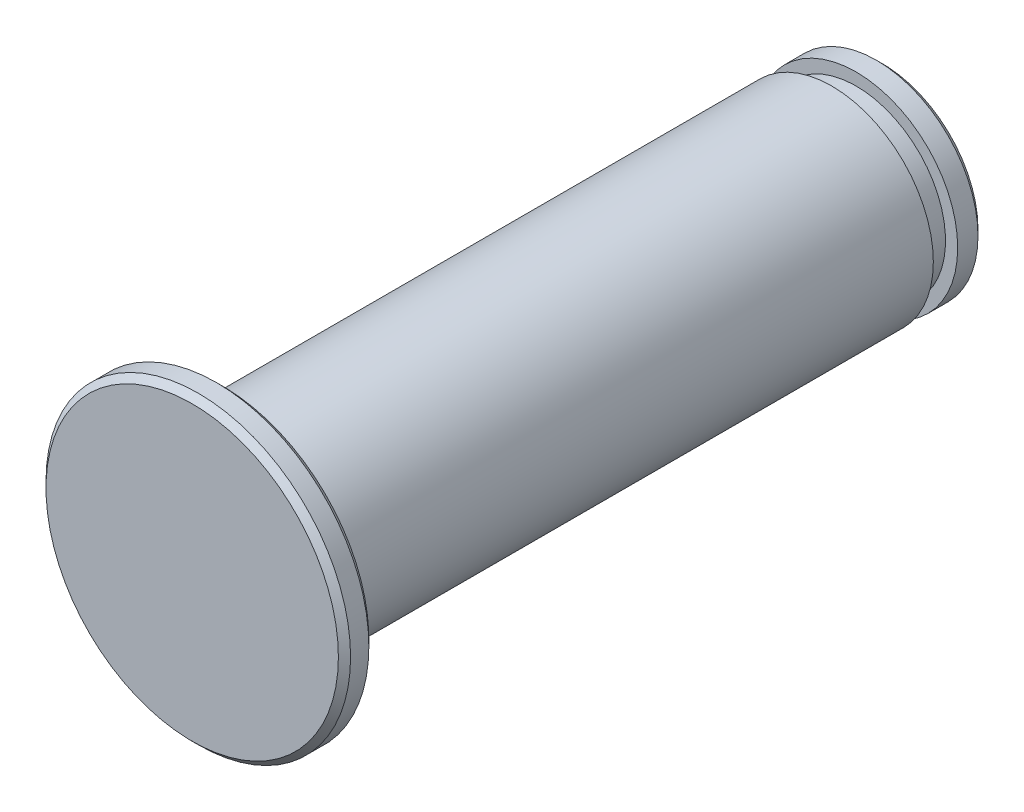
ISO-10303-21;
HEADER;
FILE_DESCRIPTION(('STEP AP214'),'2;1');
FILE_NAME('part.step','',(''),(''),'','','');
FILE_SCHEMA(('AUTOMOTIVE_DESIGN { 1 0 10303 214 1 1 1 1 }'));
ENDSEC;
DATA;
#1=APPLICATION_CONTEXT('core data for automotive mechanical design processes');
#2=APPLICATION_PROTOCOL_DEFINITION('international standard','automotive_design',2000,#1);
#3=PRODUCT_CONTEXT('',#1,'mechanical');
#4=PRODUCT('Part','Part','',(#3));
#5=PRODUCT_RELATED_PRODUCT_CATEGORY('part','',(#4));
#6=PRODUCT_DEFINITION_FORMATION('','',#4);
#7=PRODUCT_DEFINITION_CONTEXT('part definition',#1,'design');
#8=PRODUCT_DEFINITION('design','',#6,#7);
#9=PRODUCT_DEFINITION_SHAPE('','',#8);
#10=(LENGTH_UNIT() NAMED_UNIT(*) SI_UNIT(.MILLI.,.METRE.));
#11=(NAMED_UNIT(*) PLANE_ANGLE_UNIT() SI_UNIT($,.RADIAN.));
#12=(NAMED_UNIT(*) SI_UNIT($,.STERADIAN.) SOLID_ANGLE_UNIT());
#13=UNCERTAINTY_MEASURE_WITH_UNIT(LENGTH_MEASURE(1.E-05),#10,'distance_accuracy_value','');
#14=(GEOMETRIC_REPRESENTATION_CONTEXT(3) GLOBAL_UNCERTAINTY_ASSIGNED_CONTEXT((#13)) GLOBAL_UNIT_ASSIGNED_CONTEXT((#10,
#11,#12)) REPRESENTATION_CONTEXT('',''));
#15=CARTESIAN_POINT('',(0.,0.,0.));
#16=DIRECTION('',(0.,0.,1.));
#17=DIRECTION('',(1.,0.,0.));
#18=AXIS2_PLACEMENT_3D('',#15,#16,#17);
#19=CARTESIAN_POINT('',(0.,0.,17.6184151785714));
#20=DIRECTION('',(0.,0.,1.));
#21=DIRECTION('',(1.,0.,0.));
#22=AXIS2_PLACEMENT_3D('',#19,#20,#21);
#23=PLANE('',#22);
#24=CARTESIAN_POINT('',(0.,0.,17.6184151785714));
#25=DIRECTION('',(0.,0.,1.));
#26=DIRECTION('',(1.,0.,0.));
#27=AXIS2_PLACEMENT_3D('',#24,#25,#26);
#28=CIRCLE('',#27,7.19999999999999);
#29=CARTESIAN_POINT('',(7.19999999999999,0.,17.6184151785714));
#30=VERTEX_POINT('',#29);
#31=EDGE_CURVE('E36',#30,#30,#28,.T.);
#32=ORIENTED_EDGE('',*,*,#31,.T.);
#33=EDGE_LOOP('',(#32));
#34=FACE_BOUND('',#33,.T.);
#35=ADVANCED_FACE('F29',(#34),#23,.T.);
#36=CARTESIAN_POINT('',(0.,0.,-34.4572544642857));
#37=DIRECTION('',(0.,0.,-1.));
#38=DIRECTION('',(-1.,0.,0.));
#39=AXIS2_PLACEMENT_3D('',#36,#37,#38);
#40=CYLINDRICAL_SURFACE('',#39,7.49999999999999);
#41=CARTESIAN_POINT('',(0.,0.,17.3184151785714));
#42=DIRECTION('',(0.,0.,1.));
#43=DIRECTION('',(1.,0.,0.));
#44=AXIS2_PLACEMENT_3D('',#41,#42,#43);
#45=CIRCLE('',#44,7.49999999999999);
#46=CARTESIAN_POINT('',(7.49999999999999,0.,17.3184151785714));
#47=VERTEX_POINT('',#46);
#48=EDGE_CURVE('E40',#47,#47,#45,.F.);
#49=ORIENTED_EDGE('',*,*,#48,.T.);
#50=EDGE_LOOP('',(#49));
#51=FACE_BOUND('',#50,.T.);
#52=CARTESIAN_POINT('',(0.,0.,16.4184151785714));
#53=DIRECTION('',(0.,0.,-1.));
#54=DIRECTION('',(-1.,0.,0.));
#55=AXIS2_PLACEMENT_3D('',#52,#53,#54);
#56=CIRCLE('',#55,7.49999999999999);
#57=CARTESIAN_POINT('',(-7.49999999999999,0.,16.4184151785714));
#58=VERTEX_POINT('',#57);
#59=EDGE_CURVE('E44',#58,#58,#56,.F.);
#60=ORIENTED_EDGE('',*,*,#59,.T.);
#61=EDGE_LOOP('',(#60));
#62=FACE_BOUND('',#61,.T.);
#63=ADVANCED_FACE('F89',(#51,#62),#40,.T.);
#64=CARTESIAN_POINT('',(-7.49999999999999,0.,16.1184151785714));
#65=DIRECTION('',(0.,0.,-1.));
#66=DIRECTION('',(-1.,0.,0.));
#67=AXIS2_PLACEMENT_3D('',#64,#65,#66);
#68=PLANE('',#67);
#69=CARTESIAN_POINT('',(0.,0.,16.1184151785714));
#70=DIRECTION('',(0.,0.,-1.));
#71=DIRECTION('',(-1.,0.,0.));
#72=AXIS2_PLACEMENT_3D('',#69,#70,#71);
#73=CIRCLE('',#72,7.19999999999999);
#74=CARTESIAN_POINT('',(-7.19999999999999,0.,16.1184151785714));
#75=VERTEX_POINT('',#74);
#76=EDGE_CURVE('E10',#75,#75,#73,.T.);
#77=ORIENTED_EDGE('',*,*,#76,.T.);
#78=EDGE_LOOP('',(#77));
#79=FACE_BOUND('',#78,.T.);
#80=CARTESIAN_POINT('',(0.,0.,16.1184151785714));
#81=DIRECTION('',(0.,0.,-1.));
#82=DIRECTION('',(-1.,0.,0.));
#83=AXIS2_PLACEMENT_3D('',#80,#81,#82);
#84=CIRCLE('',#83,4.99999999999999);
#85=CARTESIAN_POINT('',(-4.99999999999999,0.,16.1184151785714));
#86=VERTEX_POINT('',#85);
#87=EDGE_CURVE('E55',#86,#86,#84,.T.);
#88=ORIENTED_EDGE('',*,*,#87,.F.);
#89=EDGE_LOOP('',(#88));
#90=FACE_BOUND('',#89,.T.);
#91=ADVANCED_FACE('F94',(#79,#90),#68,.T.);
#92=CARTESIAN_POINT('',(0.,0.,-34.4572544642857));
#93=DIRECTION('',(0.,0.,-1.));
#94=DIRECTION('',(-1.,0.,0.));
#95=AXIS2_PLACEMENT_3D('',#92,#93,#94);
#96=CYLINDRICAL_SURFACE('',#95,4.99999999999999);
#97=ORIENTED_EDGE('',*,*,#87,.T.);
#98=EDGE_LOOP('',(#97));
#99=FACE_BOUND('',#98,.T.);
#100=CARTESIAN_POINT('',(0.,0.,-13.8815848214286));
#101=DIRECTION('',(0.,0.,-1.));
#102=DIRECTION('',(-1.,0.,0.));
#103=AXIS2_PLACEMENT_3D('',#100,#101,#102);
#104=CIRCLE('',#103,4.99999999999999);
#105=CARTESIAN_POINT('',(-4.99999999999999,0.,-13.8815848214286));
#106=VERTEX_POINT('',#105);
#107=EDGE_CURVE('E58',#106,#106,#104,.T.);
#108=ORIENTED_EDGE('',*,*,#107,.F.);
#109=EDGE_LOOP('',(#108));
#110=FACE_BOUND('',#109,.T.);
#111=ADVANCED_FACE('F151',(#99,#110),#96,.T.);
#112=CARTESIAN_POINT('',(-4.99999999999999,0.,-13.8815848214286));
#113=DIRECTION('',(0.,0.,-1.));
#114=DIRECTION('',(-1.,0.,0.));
#115=AXIS2_PLACEMENT_3D('',#112,#113,#114);
#116=PLANE('',#115);
#117=ORIENTED_EDGE('',*,*,#107,.T.);
#118=EDGE_LOOP('',(#117));
#119=FACE_BOUND('',#118,.T.);
#120=CARTESIAN_POINT('',(0.,0.,-13.8815848214286));
#121=DIRECTION('',(0.,0.,-1.));
#122=DIRECTION('',(-1.,0.,0.));
#123=AXIS2_PLACEMENT_3D('',#120,#121,#122);
#124=CIRCLE('',#123,4.39999999999999);
#125=CARTESIAN_POINT('',(-4.39999999999999,0.,-13.8815848214286));
#126=VERTEX_POINT('',#125);
#127=EDGE_CURVE('E61',#126,#126,#124,.T.);
#128=ORIENTED_EDGE('',*,*,#127,.F.);
#129=EDGE_LOOP('',(#128));
#130=FACE_BOUND('',#129,.T.);
#131=ADVANCED_FACE('F85',(#119,#130),#116,.T.);
#132=CARTESIAN_POINT('',(0.,0.,-34.4572544642857));
#133=DIRECTION('',(0.,0.,-1.));
#134=DIRECTION('',(-1.,0.,0.));
#135=AXIS2_PLACEMENT_3D('',#132,#133,#134);
#136=CYLINDRICAL_SURFACE('',#135,4.39999999999999);
#137=ORIENTED_EDGE('',*,*,#127,.T.);
#138=EDGE_LOOP('',(#137));
#139=FACE_BOUND('',#138,.T.);
#140=CARTESIAN_POINT('',(0.,0.,-15.0815848214286));
#141=DIRECTION('',(0.,0.,-1.));
#142=DIRECTION('',(-1.,0.,0.));
#143=AXIS2_PLACEMENT_3D('',#140,#141,#142);
#144=CIRCLE('',#143,4.39999999999999);
#145=CARTESIAN_POINT('',(-4.39999999999999,0.,-15.0815848214286));
#146=VERTEX_POINT('',#145);
#147=EDGE_CURVE('E64',#146,#146,#144,.T.);
#148=ORIENTED_EDGE('',*,*,#147,.F.);
#149=EDGE_LOOP('',(#148));
#150=FACE_BOUND('',#149,.T.);
#151=ADVANCED_FACE('F75',(#139,#150),#136,.T.);
#152=CARTESIAN_POINT('',(-4.39999999999999,0.,-15.0815848214286));
#153=DIRECTION('',(0.,0.,1.));
#154=DIRECTION('',(1.,0.,0.));
#155=AXIS2_PLACEMENT_3D('',#152,#153,#154);
#156=PLANE('',#155);
#157=ORIENTED_EDGE('',*,*,#147,.T.);
#158=EDGE_LOOP('',(#157));
#159=FACE_BOUND('',#158,.T.);
#160=CARTESIAN_POINT('',(0.,0.,-15.0815848214286));
#161=DIRECTION('',(0.,0.,-1.));
#162=DIRECTION('',(-1.,0.,0.));
#163=AXIS2_PLACEMENT_3D('',#160,#161,#162);
#164=CIRCLE('',#163,4.99999999999999);
#165=CARTESIAN_POINT('',(-4.99999999999999,0.,-15.0815848214286));
#166=VERTEX_POINT('',#165);
#167=EDGE_CURVE('E67',#166,#166,#164,.T.);
#168=ORIENTED_EDGE('',*,*,#167,.F.);
#169=EDGE_LOOP('',(#168));
#170=FACE_BOUND('',#169,.T.);
#171=ADVANCED_FACE('F73',(#159,#170),#156,.T.);
#172=CARTESIAN_POINT('',(0.,0.,-34.4572544642857));
#173=DIRECTION('',(0.,0.,-1.));
#174=DIRECTION('',(-1.,0.,0.));
#175=AXIS2_PLACEMENT_3D('',#172,#173,#174);
#176=CYLINDRICAL_SURFACE('',#175,4.99999999999999);
#177=CARTESIAN_POINT('',(0.,0.,-16.0815848214286));
#178=DIRECTION('',(0.,0.,-1.));
#179=DIRECTION('',(-1.,0.,0.));
#180=AXIS2_PLACEMENT_3D('',#177,#178,#179);
#181=CIRCLE('',#180,4.99999999999999);
#182=CARTESIAN_POINT('',(-4.99999999999999,0.,-16.0815848214286));
#183=VERTEX_POINT('',#182);
#184=EDGE_CURVE('E49',#183,#183,#181,.F.);
#185=ORIENTED_EDGE('',*,*,#184,.T.);
#186=EDGE_LOOP('',(#185));
#187=FACE_BOUND('',#186,.T.);
#188=ORIENTED_EDGE('',*,*,#167,.T.);
#189=EDGE_LOOP('',(#188));
#190=FACE_BOUND('',#189,.T.);
#191=ADVANCED_FACE('F71',(#187,#190),#176,.T.);
#192=CARTESIAN_POINT('',(-4.99999999999999,0.,-16.3815848214286));
#193=DIRECTION('',(0.,0.,-1.));
#194=DIRECTION('',(-1.,0.,0.));
#195=AXIS2_PLACEMENT_3D('',#192,#193,#194);
#196=PLANE('',#195);
#197=CARTESIAN_POINT('',(0.,0.,-16.3815848214286));
#198=DIRECTION('',(0.,0.,-1.));
#199=DIRECTION('',(-1.,0.,0.));
#200=AXIS2_PLACEMENT_3D('',#197,#198,#199);
#201=CIRCLE('',#200,4.69999999999998);
#202=CARTESIAN_POINT('',(-4.69999999999998,0.,-16.3815848214286));
#203=VERTEX_POINT('',#202);
#204=EDGE_CURVE('E52',#203,#203,#201,.T.);
#205=ORIENTED_EDGE('',*,*,#204,.T.);
#206=EDGE_LOOP('',(#205));
#207=FACE_BOUND('',#206,.T.);
#208=ADVANCED_FACE('F82',(#207),#196,.T.);
#209=CARTESIAN_POINT('',(0.,0.,-16.3815848214286));
#210=DIRECTION('',(0.,0.,1.));
#211=DIRECTION('',(1.,0.,0.));
#212=AXIS2_PLACEMENT_3D('',#209,#210,#211);
#213=CONICAL_SURFACE('',#212,4.69999999999998,0.785398163397447);
#214=ORIENTED_EDGE('',*,*,#184,.F.);
#215=EDGE_LOOP('',(#214));
#216=FACE_BOUND('',#215,.T.);
#217=ORIENTED_EDGE('',*,*,#204,.F.);
#218=EDGE_LOOP('',(#217));
#219=FACE_BOUND('',#218,.T.);
#220=ADVANCED_FACE('F99',(#216,#219),#213,.T.);
#221=CARTESIAN_POINT('',(0.,0.,17.3184151785714));
#222=DIRECTION('',(0.,0.,-1.));
#223=DIRECTION('',(-1.,0.,0.));
#224=AXIS2_PLACEMENT_3D('',#221,#222,#223);
#225=CONICAL_SURFACE('',#224,7.49999999999999,0.78539816339744);
#226=ORIENTED_EDGE('',*,*,#31,.F.);
#227=EDGE_LOOP('',(#226));
#228=FACE_BOUND('',#227,.T.);
#229=ORIENTED_EDGE('',*,*,#48,.F.);
#230=EDGE_LOOP('',(#229));
#231=FACE_BOUND('',#230,.T.);
#232=ADVANCED_FACE('F101',(#228,#231),#225,.T.);
#233=CARTESIAN_POINT('',(0.,0.,16.1184151785714));
#234=DIRECTION('',(0.,0.,1.));
#235=DIRECTION('',(1.,0.,0.));
#236=AXIS2_PLACEMENT_3D('',#233,#234,#235);
#237=CONICAL_SURFACE('',#236,7.19999999999999,0.785398163397432);
#238=ORIENTED_EDGE('',*,*,#59,.F.);
#239=EDGE_LOOP('',(#238));
#240=FACE_BOUND('',#239,.T.);
#241=ORIENTED_EDGE('',*,*,#76,.F.);
#242=EDGE_LOOP('',(#241));
#243=FACE_BOUND('',#242,.T.);
#244=ADVANCED_FACE('F31',(#240,#243),#237,.T.);
#245=CLOSED_SHELL('',(#35,#63,#91,#111,#131,#151,#171,#191,#208,#220,#232,#244));
#246=MANIFOLD_SOLID_BREP('B2',#245);
#247=ADVANCED_BREP_SHAPE_REPRESENTATION('',(#18,#246),#14);
#248=SHAPE_DEFINITION_REPRESENTATION(#9,#247);
ENDSEC;
END-ISO-10303-21;
